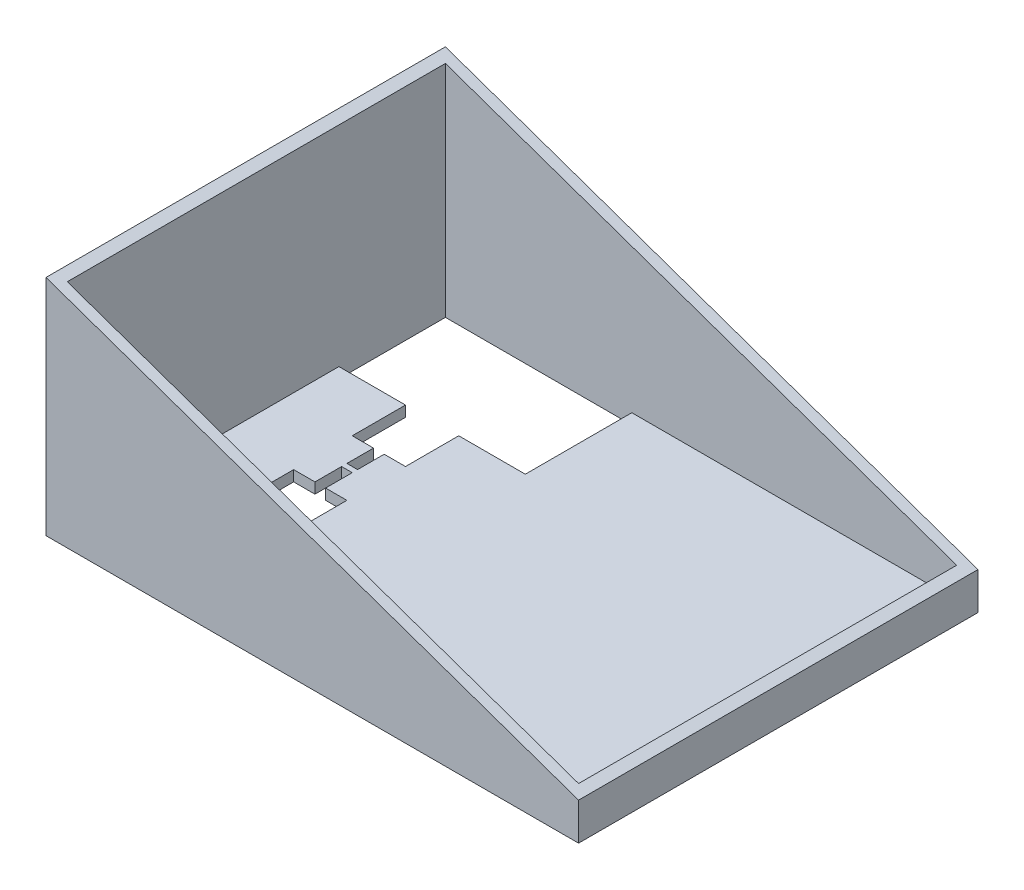
ISO-10303-21;
HEADER;
FILE_DESCRIPTION(('STEP AP214'),'2;1');
FILE_NAME('part.step','',(''),(''),'','','');
FILE_SCHEMA(('AUTOMOTIVE_DESIGN { 1 0 10303 214 1 1 1 1 }'));
ENDSEC;
DATA;
#1=APPLICATION_CONTEXT('core data for automotive mechanical design processes');
#2=APPLICATION_PROTOCOL_DEFINITION('international standard','automotive_design',2000,#1);
#3=PRODUCT_CONTEXT('',#1,'mechanical');
#4=PRODUCT('Part','Part','',(#3));
#5=PRODUCT_RELATED_PRODUCT_CATEGORY('part','',(#4));
#6=PRODUCT_DEFINITION_FORMATION('','',#4);
#7=PRODUCT_DEFINITION_CONTEXT('part definition',#1,'design');
#8=PRODUCT_DEFINITION('design','',#6,#7);
#9=PRODUCT_DEFINITION_SHAPE('','',#8);
#10=(LENGTH_UNIT() NAMED_UNIT(*) SI_UNIT(.MILLI.,.METRE.));
#11=(NAMED_UNIT(*) PLANE_ANGLE_UNIT() SI_UNIT($,.RADIAN.));
#12=(NAMED_UNIT(*) SI_UNIT($,.STERADIAN.) SOLID_ANGLE_UNIT());
#13=UNCERTAINTY_MEASURE_WITH_UNIT(LENGTH_MEASURE(1.E-05),#10,'distance_accuracy_value','');
#14=(GEOMETRIC_REPRESENTATION_CONTEXT(3) GLOBAL_UNCERTAINTY_ASSIGNED_CONTEXT((#13)) GLOBAL_UNIT_ASSIGNED_CONTEXT((#10,
#11,#12)) REPRESENTATION_CONTEXT('',''));
#15=CARTESIAN_POINT('',(0.,0.,0.));
#16=DIRECTION('',(0.,0.,1.));
#17=DIRECTION('',(1.,0.,0.));
#18=AXIS2_PLACEMENT_3D('',#15,#16,#17);
#19=CARTESIAN_POINT('',(0.,4.,0.));
#20=DIRECTION('',(0.,1.,0.));
#21=DIRECTION('',(0.,0.,1.));
#22=AXIS2_PLACEMENT_3D('',#19,#20,#21);
#23=PLANE('',#22);
#24=DIRECTION('',(1.,0.,0.));
#25=VECTOR('',#24,1.);
#26=CARTESIAN_POINT('',(0.,4.,-106.));
#27=LINE('',#26,#25);
#28=CARTESIAN_POINT('',(-196.,4.,-106.));
#29=VERTEX_POINT('',#28);
#30=CARTESIAN_POINT('',(-171.,4.,-106.));
#31=VERTEX_POINT('',#30);
#32=EDGE_CURVE('E434',#29,#31,#27,.T.);
#33=ORIENTED_EDGE('',*,*,#32,.F.);
#34=DIRECTION('',(0.,0.,1.));
#35=VECTOR('',#34,1.);
#36=CARTESIAN_POINT('',(-196.,4.,-146.));
#37=LINE('',#36,#35);
#38=CARTESIAN_POINT('',(-196.,4.,-44.));
#39=VERTEX_POINT('',#38);
#40=EDGE_CURVE('E51',#29,#39,#37,.T.);
#41=ORIENTED_EDGE('',*,*,#40,.T.);
#42=DIRECTION('',(1.,0.,0.));
#43=VECTOR('',#42,1.);
#44=CARTESIAN_POINT('',(0.,4.,-44.));
#45=LINE('',#44,#43);
#46=CARTESIAN_POINT('',(-171.,4.,-44.));
#47=VERTEX_POINT('',#46);
#48=EDGE_CURVE('E454',#39,#47,#45,.T.);
#49=ORIENTED_EDGE('',*,*,#48,.T.);
#50=DIRECTION('',(0.,0.,-1.));
#51=VECTOR('',#50,1.);
#52=CARTESIAN_POINT('',(-171.,4.,2.37310171513627E-13));
#53=LINE('',#52,#51);
#54=CARTESIAN_POINT('',(-171.,4.,-64.));
#55=VERTEX_POINT('',#54);
#56=EDGE_CURVE('E457',#47,#55,#53,.T.);
#57=ORIENTED_EDGE('',*,*,#56,.T.);
#58=DIRECTION('',(1.,0.,0.));
#59=VECTOR('',#58,1.);
#60=CARTESIAN_POINT('',(0.,4.,-64.0000000000002));
#61=LINE('',#60,#59);
#62=CARTESIAN_POINT('',(-163.,4.,-64.));
#63=VERTEX_POINT('',#62);
#64=EDGE_CURVE('E460',#55,#63,#61,.T.);
#65=ORIENTED_EDGE('',*,*,#64,.T.);
#66=DIRECTION('',(0.,0.,-1.));
#67=VECTOR('',#66,1.);
#68=CARTESIAN_POINT('',(-163.,4.,0.));
#69=LINE('',#68,#67);
#70=CARTESIAN_POINT('',(-163.,4.,-74.));
#71=VERTEX_POINT('',#70);
#72=EDGE_CURVE('E463',#63,#71,#69,.T.);
#73=ORIENTED_EDGE('',*,*,#72,.T.);
#74=DIRECTION('',(1.,0.,0.));
#75=VECTOR('',#74,1.);
#76=CARTESIAN_POINT('',(0.,4.,-74.));
#77=LINE('',#76,#75);
#78=CARTESIAN_POINT('',(-159.,4.,-74.));
#79=VERTEX_POINT('',#78);
#80=EDGE_CURVE('E467',#71,#79,#77,.T.);
#81=ORIENTED_EDGE('',*,*,#80,.T.);
#82=DIRECTION('',(0.,0.,-1.));
#83=VECTOR('',#82,1.);
#84=CARTESIAN_POINT('',(-159.,4.,0.));
#85=LINE('',#84,#83);
#86=CARTESIAN_POINT('',(-159.,4.,-64.));
#87=VERTEX_POINT('',#86);
#88=EDGE_CURVE('E468',#87,#79,#85,.T.);
#89=ORIENTED_EDGE('',*,*,#88,.F.);
#90=CARTESIAN_POINT('',(-151.,4.,-64.));
#91=VERTEX_POINT('',#90);
#92=EDGE_CURVE('E464',#87,#91,#61,.T.);
#93=ORIENTED_EDGE('',*,*,#92,.T.);
#94=DIRECTION('',(0.,0.,-1.));
#95=VECTOR('',#94,1.);
#96=CARTESIAN_POINT('',(-151.,4.,0.));
#97=LINE('',#96,#95);
#98=CARTESIAN_POINT('',(-151.,4.,-44.));
#99=VERTEX_POINT('',#98);
#100=EDGE_CURVE('E319',#99,#91,#97,.T.);
#101=ORIENTED_EDGE('',*,*,#100,.F.);
#102=CARTESIAN_POINT('',(-126.,4.,-44.));
#103=VERTEX_POINT('',#102);
#104=EDGE_CURVE('E275',#99,#103,#45,.T.);
#105=ORIENTED_EDGE('',*,*,#104,.T.);
#106=DIRECTION('',(0.,0.,-1.));
#107=VECTOR('',#106,1.);
#108=CARTESIAN_POINT('',(-126.,4.,0.));
#109=LINE('',#108,#107);
#110=CARTESIAN_POINT('',(-126.,4.,-4.));
#111=VERTEX_POINT('',#110);
#112=EDGE_CURVE('E451',#111,#103,#109,.T.);
#113=ORIENTED_EDGE('',*,*,#112,.F.);
#114=DIRECTION('',(1.,0.,0.));
#115=VECTOR('',#114,1.);
#116=CARTESIAN_POINT('',(-196.,4.,-4.));
#117=LINE('',#116,#115);
#118=CARTESIAN_POINT('',(-3.99999999999998,4.,-4.));
#119=VERTEX_POINT('',#118);
#120=EDGE_CURVE('E409',#111,#119,#117,.T.);
#121=ORIENTED_EDGE('',*,*,#120,.T.);
#122=DIRECTION('',(0.,0.,-1.));
#123=VECTOR('',#122,1.);
#124=CARTESIAN_POINT('',(-4.,4.,-146.));
#125=LINE('',#124,#123);
#126=CARTESIAN_POINT('',(-4.,4.,-146.));
#127=VERTEX_POINT('',#126);
#128=EDGE_CURVE('E422',#119,#127,#125,.T.);
#129=ORIENTED_EDGE('',*,*,#128,.T.);
#130=DIRECTION('',(-1.,0.,0.));
#131=VECTOR('',#130,1.);
#132=CARTESIAN_POINT('',(-196.,4.,-146.));
#133=LINE('',#132,#131);
#134=CARTESIAN_POINT('',(-126.,4.,-146.));
#135=VERTEX_POINT('',#134);
#136=EDGE_CURVE('E424',#127,#135,#133,.T.);
#137=ORIENTED_EDGE('',*,*,#136,.T.);
#138=DIRECTION('',(0.,0.,1.));
#139=VECTOR('',#138,1.);
#140=CARTESIAN_POINT('',(-126.,4.,0.));
#141=LINE('',#140,#139);
#142=CARTESIAN_POINT('',(-126.,4.,-106.));
#143=VERTEX_POINT('',#142);
#144=EDGE_CURVE('E304',#135,#143,#141,.T.);
#145=ORIENTED_EDGE('',*,*,#144,.T.);
#146=CARTESIAN_POINT('',(-151.,4.,-106.));
#147=VERTEX_POINT('',#146);
#148=EDGE_CURVE('E430',#147,#143,#27,.T.);
#149=ORIENTED_EDGE('',*,*,#148,.F.);
#150=DIRECTION('',(0.,0.,1.));
#151=VECTOR('',#150,1.);
#152=CARTESIAN_POINT('',(-151.,4.,0.));
#153=LINE('',#152,#151);
#154=CARTESIAN_POINT('',(-151.,4.,-86.));
#155=VERTEX_POINT('',#154);
#156=EDGE_CURVE('E433',#147,#155,#153,.T.);
#157=ORIENTED_EDGE('',*,*,#156,.T.);
#158=DIRECTION('',(1.,0.,0.));
#159=VECTOR('',#158,1.);
#160=CARTESIAN_POINT('',(1.19348975147204E-13,4.,-85.9999999999998));
#161=LINE('',#160,#159);
#162=CARTESIAN_POINT('',(-159.,4.,-86.));
#163=VERTEX_POINT('',#162);
#164=EDGE_CURVE('E436',#163,#155,#161,.T.);
#165=ORIENTED_EDGE('',*,*,#164,.F.);
#166=DIRECTION('',(0.,0.,1.));
#167=VECTOR('',#166,1.);
#168=CARTESIAN_POINT('',(-159.,4.,0.));
#169=LINE('',#168,#167);
#170=CARTESIAN_POINT('',(-159.,4.,-76.));
#171=VERTEX_POINT('',#170);
#172=EDGE_CURVE('E439',#163,#171,#169,.T.);
#173=ORIENTED_EDGE('',*,*,#172,.T.);
#174=DIRECTION('',(1.,0.,0.));
#175=VECTOR('',#174,1.);
#176=CARTESIAN_POINT('',(0.,4.,-76.));
#177=LINE('',#176,#175);
#178=CARTESIAN_POINT('',(-163.,4.,-76.));
#179=VERTEX_POINT('',#178);
#180=EDGE_CURVE('E442',#179,#171,#177,.T.);
#181=ORIENTED_EDGE('',*,*,#180,.F.);
#182=DIRECTION('',(0.,0.,1.));
#183=VECTOR('',#182,1.);
#184=CARTESIAN_POINT('',(-163.,4.,0.));
#185=LINE('',#184,#183);
#186=CARTESIAN_POINT('',(-163.,4.,-86.));
#187=VERTEX_POINT('',#186);
#188=EDGE_CURVE('E445',#187,#179,#185,.T.);
#189=ORIENTED_EDGE('',*,*,#188,.F.);
#190=CARTESIAN_POINT('',(-171.,4.,-86.));
#191=VERTEX_POINT('',#190);
#192=EDGE_CURVE('E440',#191,#187,#161,.T.);
#193=ORIENTED_EDGE('',*,*,#192,.F.);
#194=DIRECTION('',(0.,0.,1.));
#195=VECTOR('',#194,1.);
#196=CARTESIAN_POINT('',(-171.,4.,-2.37310171513628E-13));
#197=LINE('',#196,#195);
#198=EDGE_CURVE('E448',#31,#191,#197,.T.);
#199=ORIENTED_EDGE('',*,*,#198,.F.);
#200=EDGE_LOOP('',(#33,#41,#49,#57,#65,#73,#81,#89,#93,#101,#105,#113,#121,#129,#137,#145,#149,
#157,#165,#173,#181,#189,#193,#199));
#201=FACE_BOUND('',#200,.T.);
#202=ADVANCED_FACE('F43',(#201),#23,.T.);
#203=CARTESIAN_POINT('',(-126.,4.,0.));
#204=DIRECTION('',(-1.,0.,0.));
#205=DIRECTION('',(0.,0.,1.));
#206=AXIS2_PLACEMENT_3D('',#203,#204,#205);
#207=PLANE('',#206);
#208=DIRECTION('',(0.,0.,-1.));
#209=VECTOR('',#208,1.);
#210=CARTESIAN_POINT('',(-126.,0.,0.));
#211=LINE('',#210,#209);
#212=CARTESIAN_POINT('',(-126.,0.,-4.));
#213=VERTEX_POINT('',#212);
#214=CARTESIAN_POINT('',(-126.,0.,-44.));
#215=VERTEX_POINT('',#214);
#216=EDGE_CURVE('E355',#213,#215,#211,.T.);
#217=ORIENTED_EDGE('',*,*,#216,.F.);
#218=DIRECTION('',(0.,-1.,0.));
#219=VECTOR('',#218,1.);
#220=CARTESIAN_POINT('',(-126.,4.,-4.));
#221=LINE('',#220,#219);
#222=EDGE_CURVE('E408',#111,#213,#221,.T.);
#223=ORIENTED_EDGE('',*,*,#222,.F.);
#224=ORIENTED_EDGE('',*,*,#112,.T.);
#225=DIRECTION('',(0.,-1.,0.));
#226=VECTOR('',#225,1.);
#227=CARTESIAN_POINT('',(-126.,4.,-44.));
#228=LINE('',#227,#226);
#229=EDGE_CURVE('E271',#103,#215,#228,.T.);
#230=ORIENTED_EDGE('',*,*,#229,.T.);
#231=EDGE_LOOP('',(#217,#223,#224,#230));
#232=FACE_BOUND('',#231,.T.);
#233=ADVANCED_FACE('F485',(#232),#207,.T.);
#234=CARTESIAN_POINT('',(0.,4.,-4.));
#235=DIRECTION('',(0.,0.,-1.));
#236=DIRECTION('',(-1.,0.,0.));
#237=AXIS2_PLACEMENT_3D('',#234,#235,#236);
#238=PLANE('',#237);
#239=DIRECTION('',(-0.943858356366018,0.330350424728106,0.));
#240=VECTOR('',#239,1.);
#241=CARTESIAN_POINT('',(3.11804008908686,12.9086859688196,-4.));
#242=LINE('',#241,#240);
#243=CARTESIAN_POINT('',(-3.99999999999998,15.4,-4.));
#244=VERTEX_POINT('',#243);
#245=CARTESIAN_POINT('',(-196.,82.6,-4.));
#246=VERTEX_POINT('',#245);
#247=EDGE_CURVE('E425',#244,#246,#242,.T.);
#248=ORIENTED_EDGE('',*,*,#247,.F.);
#249=DIRECTION('',(0.,-1.,0.));
#250=VECTOR('',#249,1.);
#251=CARTESIAN_POINT('',(-3.99999999999998,84.,-4.));
#252=LINE('',#251,#250);
#253=EDGE_CURVE('E316',#244,#119,#252,.T.);
#254=ORIENTED_EDGE('',*,*,#253,.T.);
#255=ORIENTED_EDGE('',*,*,#120,.F.);
#256=ORIENTED_EDGE('',*,*,#222,.T.);
#257=DIRECTION('',(1.,0.,0.));
#258=VECTOR('',#257,1.);
#259=CARTESIAN_POINT('',(0.,0.,-4.));
#260=LINE('',#259,#258);
#261=CARTESIAN_POINT('',(-196.,0.,-4.));
#262=VERTEX_POINT('',#261);
#263=EDGE_CURVE('E358',#262,#213,#260,.T.);
#264=ORIENTED_EDGE('',*,*,#263,.F.);
#265=DIRECTION('',(0.,-1.,0.));
#266=VECTOR('',#265,1.);
#267=CARTESIAN_POINT('',(-196.,4.,-4.));
#268=LINE('',#267,#266);
#269=EDGE_CURVE('E407',#246,#262,#268,.T.);
#270=ORIENTED_EDGE('',*,*,#269,.F.);
#271=EDGE_LOOP('',(#248,#254,#255,#256,#264,#270));
#272=FACE_BOUND('',#271,.T.);
#273=ADVANCED_FACE('F493',(#272),#238,.T.);
#274=CARTESIAN_POINT('',(-196.,4.,0.));
#275=DIRECTION('',(1.,0.,0.));
#276=DIRECTION('',(0.,0.,-1.));
#277=AXIS2_PLACEMENT_3D('',#274,#275,#276);
#278=PLANE('',#277);
#279=DIRECTION('',(0.,0.,-1.));
#280=VECTOR('',#279,1.);
#281=CARTESIAN_POINT('',(-196.,82.6,0.));
#282=LINE('',#281,#280);
#283=CARTESIAN_POINT('',(-196.,82.6,-146.));
#284=VERTEX_POINT('',#283);
#285=EDGE_CURVE('E499',#246,#284,#282,.T.);
#286=ORIENTED_EDGE('',*,*,#285,.F.);
#287=ORIENTED_EDGE('',*,*,#269,.T.);
#288=DIRECTION('',(0.,0.,1.));
#289=VECTOR('',#288,1.);
#290=CARTESIAN_POINT('',(-196.,0.,0.));
#291=LINE('',#290,#289);
#292=CARTESIAN_POINT('',(-196.,0.,-44.));
#293=VERTEX_POINT('',#292);
#294=EDGE_CURVE('E346',#293,#262,#291,.T.);
#295=ORIENTED_EDGE('',*,*,#294,.F.);
#296=DIRECTION('',(0.,-1.,0.));
#297=VECTOR('',#296,1.);
#298=CARTESIAN_POINT('',(-196.,4.,-44.));
#299=LINE('',#298,#297);
#300=EDGE_CURVE('E405',#39,#293,#299,.T.);
#301=ORIENTED_EDGE('',*,*,#300,.F.);
#302=ORIENTED_EDGE('',*,*,#40,.F.);
#303=DIRECTION('',(0.,-1.,0.));
#304=VECTOR('',#303,1.);
#305=CARTESIAN_POINT('',(-196.,4.,-106.));
#306=LINE('',#305,#304);
#307=CARTESIAN_POINT('',(-196.,0.,-106.));
#308=VERTEX_POINT('',#307);
#309=EDGE_CURVE('E274',#29,#308,#306,.T.);
#310=ORIENTED_EDGE('',*,*,#309,.T.);
#311=CARTESIAN_POINT('',(-196.,0.,-146.));
#312=VERTEX_POINT('',#311);
#313=EDGE_CURVE('E343',#312,#308,#291,.T.);
#314=ORIENTED_EDGE('',*,*,#313,.F.);
#315=DIRECTION('',(0.,-1.,0.));
#316=VECTOR('',#315,1.);
#317=CARTESIAN_POINT('',(-196.,4.,-146.));
#318=LINE('',#317,#316);
#319=EDGE_CURVE('E272',#284,#312,#318,.T.);
#320=ORIENTED_EDGE('',*,*,#319,.F.);
#321=EDGE_LOOP('',(#286,#287,#295,#301,#302,#310,#314,#320));
#322=FACE_BOUND('',#321,.T.);
#323=ADVANCED_FACE('F497',(#322),#278,.T.);
#324=CARTESIAN_POINT('',(0.,4.,-44.));
#325=DIRECTION('',(0.,0.,-1.));
#326=DIRECTION('',(-1.,0.,0.));
#327=AXIS2_PLACEMENT_3D('',#324,#325,#326);
#328=PLANE('',#327);
#329=DIRECTION('',(1.,0.,0.));
#330=VECTOR('',#329,1.);
#331=CARTESIAN_POINT('',(0.,0.,-44.));
#332=LINE('',#331,#330);
#333=CARTESIAN_POINT('',(-171.,0.,-44.));
#334=VERTEX_POINT('',#333);
#335=EDGE_CURVE('E361',#293,#334,#332,.T.);
#336=ORIENTED_EDGE('',*,*,#335,.T.);
#337=DIRECTION('',(0.,-1.,0.));
#338=VECTOR('',#337,1.);
#339=CARTESIAN_POINT('',(-171.,4.,-44.));
#340=LINE('',#339,#338);
#341=EDGE_CURVE('E402',#47,#334,#340,.T.);
#342=ORIENTED_EDGE('',*,*,#341,.F.);
#343=ORIENTED_EDGE('',*,*,#48,.F.);
#344=ORIENTED_EDGE('',*,*,#300,.T.);
#345=EDGE_LOOP('',(#336,#342,#343,#344));
#346=FACE_BOUND('',#345,.T.);
#347=ADVANCED_FACE('F521',(#346),#328,.F.);
#348=CARTESIAN_POINT('',(-171.,4.,2.37310171513627E-13));
#349=DIRECTION('',(-1.,0.,0.));
#350=DIRECTION('',(0.,0.,1.));
#351=AXIS2_PLACEMENT_3D('',#348,#349,#350);
#352=PLANE('',#351);
#353=DIRECTION('',(0.,0.,-1.));
#354=VECTOR('',#353,1.);
#355=CARTESIAN_POINT('',(-171.,0.,2.37310171513627E-13));
#356=LINE('',#355,#354);
#357=CARTESIAN_POINT('',(-171.,0.,-64.));
#358=VERTEX_POINT('',#357);
#359=EDGE_CURVE('E364',#334,#358,#356,.T.);
#360=ORIENTED_EDGE('',*,*,#359,.T.);
#361=DIRECTION('',(0.,-1.,0.));
#362=VECTOR('',#361,1.);
#363=CARTESIAN_POINT('',(-171.,4.,-64.));
#364=LINE('',#363,#362);
#365=EDGE_CURVE('E399',#55,#358,#364,.T.);
#366=ORIENTED_EDGE('',*,*,#365,.F.);
#367=ORIENTED_EDGE('',*,*,#56,.F.);
#368=ORIENTED_EDGE('',*,*,#341,.T.);
#369=EDGE_LOOP('',(#360,#366,#367,#368));
#370=FACE_BOUND('',#369,.T.);
#371=ADVANCED_FACE('F542',(#370),#352,.F.);
#372=CARTESIAN_POINT('',(0.,4.,-64.0000000000002));
#373=DIRECTION('',(0.,0.,-1.));
#374=DIRECTION('',(-1.,0.,0.));
#375=AXIS2_PLACEMENT_3D('',#372,#373,#374);
#376=PLANE('',#375);
#377=DIRECTION('',(1.,0.,0.));
#378=VECTOR('',#377,1.);
#379=CARTESIAN_POINT('',(0.,0.,-64.0000000000002));
#380=LINE('',#379,#378);
#381=CARTESIAN_POINT('',(-163.,0.,-64.));
#382=VERTEX_POINT('',#381);
#383=EDGE_CURVE('E368',#358,#382,#380,.T.);
#384=ORIENTED_EDGE('',*,*,#383,.T.);
#385=DIRECTION('',(0.,-1.,0.));
#386=VECTOR('',#385,1.);
#387=CARTESIAN_POINT('',(-163.,4.,-64.));
#388=LINE('',#387,#386);
#389=EDGE_CURVE('E396',#63,#382,#388,.T.);
#390=ORIENTED_EDGE('',*,*,#389,.F.);
#391=ORIENTED_EDGE('',*,*,#64,.F.);
#392=ORIENTED_EDGE('',*,*,#365,.T.);
#393=EDGE_LOOP('',(#384,#390,#391,#392));
#394=FACE_BOUND('',#393,.T.);
#395=ADVANCED_FACE('F531',(#394),#376,.F.);
#396=CARTESIAN_POINT('',(-163.,4.,0.));
#397=DIRECTION('',(-1.,0.,0.));
#398=DIRECTION('',(0.,0.,1.));
#399=AXIS2_PLACEMENT_3D('',#396,#397,#398);
#400=PLANE('',#399);
#401=DIRECTION('',(0.,0.,-1.));
#402=VECTOR('',#401,1.);
#403=CARTESIAN_POINT('',(-163.,0.,0.));
#404=LINE('',#403,#402);
#405=CARTESIAN_POINT('',(-163.,0.,-74.));
#406=VERTEX_POINT('',#405);
#407=EDGE_CURVE('E371',#382,#406,#404,.T.);
#408=ORIENTED_EDGE('',*,*,#407,.T.);
#409=DIRECTION('',(0.,-1.,0.));
#410=VECTOR('',#409,1.);
#411=CARTESIAN_POINT('',(-163.,4.,-74.));
#412=LINE('',#411,#410);
#413=EDGE_CURVE('E393',#71,#406,#412,.T.);
#414=ORIENTED_EDGE('',*,*,#413,.F.);
#415=ORIENTED_EDGE('',*,*,#72,.F.);
#416=ORIENTED_EDGE('',*,*,#389,.T.);
#417=EDGE_LOOP('',(#408,#414,#415,#416));
#418=FACE_BOUND('',#417,.T.);
#419=ADVANCED_FACE('F537',(#418),#400,.F.);
#420=CARTESIAN_POINT('',(0.,4.,-74.));
#421=DIRECTION('',(0.,0.,-1.));
#422=DIRECTION('',(-1.,0.,0.));
#423=AXIS2_PLACEMENT_3D('',#420,#421,#422);
#424=PLANE('',#423);
#425=DIRECTION('',(1.,0.,0.));
#426=VECTOR('',#425,1.);
#427=CARTESIAN_POINT('',(0.,0.,-74.));
#428=LINE('',#427,#426);
#429=CARTESIAN_POINT('',(-159.,0.,-74.));
#430=VERTEX_POINT('',#429);
#431=EDGE_CURVE('E375',#406,#430,#428,.T.);
#432=ORIENTED_EDGE('',*,*,#431,.T.);
#433=DIRECTION('',(0.,-1.,0.));
#434=VECTOR('',#433,1.);
#435=CARTESIAN_POINT('',(-159.,4.,-74.));
#436=LINE('',#435,#434);
#437=EDGE_CURVE('E391',#79,#430,#436,.T.);
#438=ORIENTED_EDGE('',*,*,#437,.F.);
#439=ORIENTED_EDGE('',*,*,#80,.F.);
#440=ORIENTED_EDGE('',*,*,#413,.T.);
#441=EDGE_LOOP('',(#432,#438,#439,#440));
#442=FACE_BOUND('',#441,.T.);
#443=ADVANCED_FACE('F534',(#442),#424,.F.);
#444=CARTESIAN_POINT('',(-159.,4.,0.));
#445=DIRECTION('',(-1.,0.,0.));
#446=DIRECTION('',(0.,0.,1.));
#447=AXIS2_PLACEMENT_3D('',#444,#445,#446);
#448=PLANE('',#447);
#449=DIRECTION('',(0.,0.,-1.));
#450=VECTOR('',#449,1.);
#451=CARTESIAN_POINT('',(-159.,0.,0.));
#452=LINE('',#451,#450);
#453=CARTESIAN_POINT('',(-159.,0.,-64.));
#454=VERTEX_POINT('',#453);
#455=EDGE_CURVE('E378',#454,#430,#452,.T.);
#456=ORIENTED_EDGE('',*,*,#455,.F.);
#457=DIRECTION('',(0.,-1.,0.));
#458=VECTOR('',#457,1.);
#459=CARTESIAN_POINT('',(-159.,4.,-64.));
#460=LINE('',#459,#458);
#461=EDGE_CURVE('E389',#87,#454,#460,.T.);
#462=ORIENTED_EDGE('',*,*,#461,.F.);
#463=ORIENTED_EDGE('',*,*,#88,.T.);
#464=ORIENTED_EDGE('',*,*,#437,.T.);
#465=EDGE_LOOP('',(#456,#462,#463,#464));
#466=FACE_BOUND('',#465,.T.);
#467=ADVANCED_FACE('F529',(#466),#448,.T.);
#468=CARTESIAN_POINT('',(-151.,0.,-64.));
#469=VERTEX_POINT('',#468);
#470=EDGE_CURVE('E372',#454,#469,#380,.T.);
#471=ORIENTED_EDGE('',*,*,#470,.T.);
#472=DIRECTION('',(0.,-1.,0.));
#473=VECTOR('',#472,1.);
#474=CARTESIAN_POINT('',(-151.,4.,-64.));
#475=LINE('',#474,#473);
#476=EDGE_CURVE('E387',#91,#469,#475,.T.);
#477=ORIENTED_EDGE('',*,*,#476,.F.);
#478=ORIENTED_EDGE('',*,*,#92,.F.);
#479=ORIENTED_EDGE('',*,*,#461,.T.);
#480=EDGE_LOOP('',(#471,#477,#478,#479));
#481=FACE_BOUND('',#480,.T.);
#482=ADVANCED_FACE('F526',(#481),#376,.F.);
#483=CARTESIAN_POINT('',(-151.,4.,0.));
#484=DIRECTION('',(-1.,0.,0.));
#485=DIRECTION('',(0.,0.,1.));
#486=AXIS2_PLACEMENT_3D('',#483,#484,#485);
#487=PLANE('',#486);
#488=DIRECTION('',(0.,0.,-1.));
#489=VECTOR('',#488,1.);
#490=CARTESIAN_POINT('',(-151.,0.,0.));
#491=LINE('',#490,#489);
#492=CARTESIAN_POINT('',(-151.,0.,-44.));
#493=VERTEX_POINT('',#492);
#494=EDGE_CURVE('E381',#493,#469,#491,.T.);
#495=ORIENTED_EDGE('',*,*,#494,.F.);
#496=DIRECTION('',(0.,-1.,0.));
#497=VECTOR('',#496,1.);
#498=CARTESIAN_POINT('',(-151.,4.,-44.));
#499=LINE('',#498,#497);
#500=EDGE_CURVE('E385',#99,#493,#499,.T.);
#501=ORIENTED_EDGE('',*,*,#500,.F.);
#502=ORIENTED_EDGE('',*,*,#100,.T.);
#503=ORIENTED_EDGE('',*,*,#476,.T.);
#504=EDGE_LOOP('',(#495,#501,#502,#503));
#505=FACE_BOUND('',#504,.T.);
#506=ADVANCED_FACE('F522',(#505),#487,.T.);
#507=CARTESIAN_POINT('',(-200.,4.,0.));
#508=DIRECTION('',(-1.,0.,0.));
#509=DIRECTION('',(0.,0.,1.));
#510=AXIS2_PLACEMENT_3D('',#507,#508,#509);
#511=PLANE('',#510);
#512=DIRECTION('',(0.,0.,-1.));
#513=VECTOR('',#512,1.);
#514=CARTESIAN_POINT('',(-200.,0.,0.));
#515=LINE('',#514,#513);
#516=CARTESIAN_POINT('',(-200.,0.,0.));
#517=VERTEX_POINT('',#516);
#518=CARTESIAN_POINT('',(-200.,0.,-150.));
#519=VERTEX_POINT('',#518);
#520=EDGE_CURVE('E345',#517,#519,#515,.T.);
#521=ORIENTED_EDGE('',*,*,#520,.F.);
#522=DIRECTION('',(0.,-1.,0.));
#523=VECTOR('',#522,1.);
#524=CARTESIAN_POINT('',(-200.,4.,0.));
#525=LINE('',#524,#523);
#526=CARTESIAN_POINT('',(-200.,84.,0.));
#527=VERTEX_POINT('',#526);
#528=EDGE_CURVE('E264',#527,#517,#525,.T.);
#529=ORIENTED_EDGE('',*,*,#528,.F.);
#530=DIRECTION('',(0.,0.,1.));
#531=VECTOR('',#530,1.);
#532=CARTESIAN_POINT('',(-200.,84.,0.));
#533=LINE('',#532,#531);
#534=CARTESIAN_POINT('',(-200.,84.,-150.));
#535=VERTEX_POINT('',#534);
#536=EDGE_CURVE('E312',#535,#527,#533,.T.);
#537=ORIENTED_EDGE('',*,*,#536,.F.);
#538=DIRECTION('',(0.,-1.,0.));
#539=VECTOR('',#538,1.);
#540=CARTESIAN_POINT('',(-200.,4.,-150.));
#541=LINE('',#540,#539);
#542=EDGE_CURVE('E255',#535,#519,#541,.T.);
#543=ORIENTED_EDGE('',*,*,#542,.T.);
#544=EDGE_LOOP('',(#521,#529,#537,#543));
#545=FACE_BOUND('',#544,.T.);
#546=ADVANCED_FACE('F525',(#545),#511,.T.);
#547=CARTESIAN_POINT('',(0.,4.,0.));
#548=DIRECTION('',(0.,0.,1.));
#549=DIRECTION('',(1.,0.,0.));
#550=AXIS2_PLACEMENT_3D('',#547,#548,#549);
#551=PLANE('',#550);
#552=DIRECTION('',(0.943858356366017,-0.330350424728106,0.));
#553=VECTOR('',#552,1.);
#554=CARTESIAN_POINT('',(-200.,84.,0.));
#555=LINE('',#554,#553);
#556=CARTESIAN_POINT('',(0.,14.,0.));
#557=VERTEX_POINT('',#556);
#558=EDGE_CURVE('E245',#527,#557,#555,.T.);
#559=ORIENTED_EDGE('',*,*,#558,.F.);
#560=ORIENTED_EDGE('',*,*,#528,.T.);
#561=DIRECTION('',(-1.,0.,0.));
#562=VECTOR('',#561,1.);
#563=CARTESIAN_POINT('',(0.,0.,0.));
#564=LINE('',#563,#562);
#565=CARTESIAN_POINT('',(0.,0.,0.));
#566=VERTEX_POINT('',#565);
#567=EDGE_CURVE('E349',#566,#517,#564,.T.);
#568=ORIENTED_EDGE('',*,*,#567,.F.);
#569=DIRECTION('',(0.,-1.,0.));
#570=VECTOR('',#569,1.);
#571=CARTESIAN_POINT('',(0.,4.,0.));
#572=LINE('',#571,#570);
#573=EDGE_CURVE('E262',#557,#566,#572,.T.);
#574=ORIENTED_EDGE('',*,*,#573,.F.);
#575=EDGE_LOOP('',(#559,#560,#568,#574));
#576=FACE_BOUND('',#575,.T.);
#577=ADVANCED_FACE('F555',(#576),#551,.T.);
#578=CARTESIAN_POINT('',(0.,4.,0.));
#579=DIRECTION('',(-1.,0.,0.));
#580=DIRECTION('',(0.,0.,1.));
#581=AXIS2_PLACEMENT_3D('',#578,#579,#580);
#582=PLANE('',#581);
#583=DIRECTION('',(0.,-1.,0.));
#584=VECTOR('',#583,1.);
#585=CARTESIAN_POINT('',(0.,4.,-150.));
#586=LINE('',#585,#584);
#587=CARTESIAN_POINT('',(0.,14.,-150.));
#588=VERTEX_POINT('',#587);
#589=CARTESIAN_POINT('',(0.,0.,-150.));
#590=VERTEX_POINT('',#589);
#591=EDGE_CURVE('E253',#588,#590,#586,.T.);
#592=ORIENTED_EDGE('',*,*,#591,.F.);
#593=DIRECTION('',(0.,0.,1.));
#594=VECTOR('',#593,1.);
#595=CARTESIAN_POINT('',(0.,14.,-150.));
#596=LINE('',#595,#594);
#597=EDGE_CURVE('E239',#588,#557,#596,.T.);
#598=ORIENTED_EDGE('',*,*,#597,.T.);
#599=ORIENTED_EDGE('',*,*,#573,.T.);
#600=DIRECTION('',(0.,0.,-1.));
#601=VECTOR('',#600,1.);
#602=CARTESIAN_POINT('',(0.,0.,0.));
#603=LINE('',#602,#601);
#604=EDGE_CURVE('E261',#566,#590,#603,.T.);
#605=ORIENTED_EDGE('',*,*,#604,.T.);
#606=EDGE_LOOP('',(#592,#598,#599,#605));
#607=FACE_BOUND('',#606,.T.);
#608=ADVANCED_FACE('F259',(#607),#582,.F.);
#609=CARTESIAN_POINT('',(0.,4.,-146.));
#610=DIRECTION('',(0.,0.,-1.));
#611=DIRECTION('',(-1.,0.,0.));
#612=AXIS2_PLACEMENT_3D('',#609,#610,#611);
#613=PLANE('',#612);
#614=DIRECTION('',(0.,-1.,0.));
#615=VECTOR('',#614,1.);
#616=CARTESIAN_POINT('',(-4.,84.,-146.));
#617=LINE('',#616,#615);
#618=CARTESIAN_POINT('',(-4.,15.4,-146.));
#619=VERTEX_POINT('',#618);
#620=EDGE_CURVE('E64',#619,#127,#617,.T.);
#621=ORIENTED_EDGE('',*,*,#620,.F.);
#622=DIRECTION('',(-0.943858356366018,0.330350424728106,0.));
#623=VECTOR('',#622,1.);
#624=CARTESIAN_POINT('',(3.11804008908686,12.9086859688196,-146.));
#625=LINE('',#624,#623);
#626=EDGE_CURVE('E57',#619,#284,#625,.T.);
#627=ORIENTED_EDGE('',*,*,#626,.T.);
#628=ORIENTED_EDGE('',*,*,#319,.T.);
#629=DIRECTION('',(1.,0.,0.));
#630=VECTOR('',#629,1.);
#631=CARTESIAN_POINT('',(0.,0.,-146.));
#632=LINE('',#631,#630);
#633=CARTESIAN_POINT('',(-126.,0.,-146.));
#634=VERTEX_POINT('',#633);
#635=EDGE_CURVE('E307',#312,#634,#632,.T.);
#636=ORIENTED_EDGE('',*,*,#635,.T.);
#637=DIRECTION('',(0.,-1.,0.));
#638=VECTOR('',#637,1.);
#639=CARTESIAN_POINT('',(-126.,4.,-146.));
#640=LINE('',#639,#638);
#641=EDGE_CURVE('E266',#135,#634,#640,.T.);
#642=ORIENTED_EDGE('',*,*,#641,.F.);
#643=ORIENTED_EDGE('',*,*,#136,.F.);
#644=EDGE_LOOP('',(#621,#627,#628,#636,#642,#643));
#645=FACE_BOUND('',#644,.T.);
#646=ADVANCED_FACE('F45',(#645),#613,.F.);
#647=CARTESIAN_POINT('',(-126.,4.,0.));
#648=DIRECTION('',(1.,0.,0.));
#649=DIRECTION('',(0.,0.,-1.));
#650=AXIS2_PLACEMENT_3D('',#647,#648,#649);
#651=PLANE('',#650);
#652=DIRECTION('',(0.,0.,1.));
#653=VECTOR('',#652,1.);
#654=CARTESIAN_POINT('',(-126.,0.,0.));
#655=LINE('',#654,#653);
#656=CARTESIAN_POINT('',(-126.,0.,-106.));
#657=VERTEX_POINT('',#656);
#658=EDGE_CURVE('E302',#634,#657,#655,.T.);
#659=ORIENTED_EDGE('',*,*,#658,.T.);
#660=DIRECTION('',(0.,-1.,0.));
#661=VECTOR('',#660,1.);
#662=CARTESIAN_POINT('',(-126.,4.,-106.));
#663=LINE('',#662,#661);
#664=EDGE_CURVE('E293',#143,#657,#663,.T.);
#665=ORIENTED_EDGE('',*,*,#664,.F.);
#666=ORIENTED_EDGE('',*,*,#144,.F.);
#667=ORIENTED_EDGE('',*,*,#641,.T.);
#668=EDGE_LOOP('',(#659,#665,#666,#667));
#669=FACE_BOUND('',#668,.T.);
#670=ADVANCED_FACE('F300',(#669),#651,.F.);
#671=CARTESIAN_POINT('',(0.,4.,-106.));
#672=DIRECTION('',(0.,0.,-1.));
#673=DIRECTION('',(-1.,0.,0.));
#674=AXIS2_PLACEMENT_3D('',#671,#672,#673);
#675=PLANE('',#674);
#676=DIRECTION('',(1.,0.,0.));
#677=VECTOR('',#676,1.);
#678=CARTESIAN_POINT('',(0.,0.,-106.));
#679=LINE('',#678,#677);
#680=CARTESIAN_POINT('',(-151.,0.,-106.));
#681=VERTEX_POINT('',#680);
#682=EDGE_CURVE('E314',#681,#657,#679,.T.);
#683=ORIENTED_EDGE('',*,*,#682,.F.);
#684=DIRECTION('',(0.,-1.,0.));
#685=VECTOR('',#684,1.);
#686=CARTESIAN_POINT('',(-151.,4.,-106.));
#687=LINE('',#686,#685);
#688=EDGE_CURVE('E291',#147,#681,#687,.T.);
#689=ORIENTED_EDGE('',*,*,#688,.F.);
#690=ORIENTED_EDGE('',*,*,#148,.T.);
#691=ORIENTED_EDGE('',*,*,#664,.T.);
#692=EDGE_LOOP('',(#683,#689,#690,#691));
#693=FACE_BOUND('',#692,.T.);
#694=ADVANCED_FACE('F566',(#693),#675,.T.);
#695=CARTESIAN_POINT('',(-151.,4.,0.));
#696=DIRECTION('',(1.,0.,0.));
#697=DIRECTION('',(0.,0.,-1.));
#698=AXIS2_PLACEMENT_3D('',#695,#696,#697);
#699=PLANE('',#698);
#700=DIRECTION('',(0.,0.,1.));
#701=VECTOR('',#700,1.);
#702=CARTESIAN_POINT('',(-151.,0.,0.));
#703=LINE('',#702,#701);
#704=CARTESIAN_POINT('',(-151.,0.,-86.));
#705=VERTEX_POINT('',#704);
#706=EDGE_CURVE('E323',#681,#705,#703,.T.);
#707=ORIENTED_EDGE('',*,*,#706,.T.);
#708=DIRECTION('',(0.,-1.,0.));
#709=VECTOR('',#708,1.);
#710=CARTESIAN_POINT('',(-151.,4.,-86.));
#711=LINE('',#710,#709);
#712=EDGE_CURVE('E289',#155,#705,#711,.T.);
#713=ORIENTED_EDGE('',*,*,#712,.F.);
#714=ORIENTED_EDGE('',*,*,#156,.F.);
#715=ORIENTED_EDGE('',*,*,#688,.T.);
#716=EDGE_LOOP('',(#707,#713,#714,#715));
#717=FACE_BOUND('',#716,.T.);
#718=ADVANCED_FACE('F587',(#717),#699,.F.);
#719=CARTESIAN_POINT('',(1.19348975147204E-13,4.,-85.9999999999998));
#720=DIRECTION('',(0.,0.,-1.));
#721=DIRECTION('',(-1.,0.,0.));
#722=AXIS2_PLACEMENT_3D('',#719,#720,#721);
#723=PLANE('',#722);
#724=DIRECTION('',(1.,0.,0.));
#725=VECTOR('',#724,1.);
#726=CARTESIAN_POINT('',(1.19348975147204E-13,0.,-85.9999999999998));
#727=LINE('',#726,#725);
#728=CARTESIAN_POINT('',(-159.,0.,-86.));
#729=VERTEX_POINT('',#728);
#730=EDGE_CURVE('E327',#729,#705,#727,.T.);
#731=ORIENTED_EDGE('',*,*,#730,.F.);
#732=DIRECTION('',(0.,-1.,0.));
#733=VECTOR('',#732,1.);
#734=CARTESIAN_POINT('',(-159.,4.,-86.));
#735=LINE('',#734,#733);
#736=EDGE_CURVE('E287',#163,#729,#735,.T.);
#737=ORIENTED_EDGE('',*,*,#736,.F.);
#738=ORIENTED_EDGE('',*,*,#164,.T.);
#739=ORIENTED_EDGE('',*,*,#712,.T.);
#740=EDGE_LOOP('',(#731,#737,#738,#739));
#741=FACE_BOUND('',#740,.T.);
#742=ADVANCED_FACE('F575',(#741),#723,.T.);
#743=CARTESIAN_POINT('',(-159.,4.,0.));
#744=DIRECTION('',(1.,0.,0.));
#745=DIRECTION('',(0.,0.,-1.));
#746=AXIS2_PLACEMENT_3D('',#743,#744,#745);
#747=PLANE('',#746);
#748=DIRECTION('',(0.,0.,1.));
#749=VECTOR('',#748,1.);
#750=CARTESIAN_POINT('',(-159.,0.,0.));
#751=LINE('',#750,#749);
#752=CARTESIAN_POINT('',(-159.,0.,-76.));
#753=VERTEX_POINT('',#752);
#754=EDGE_CURVE('E330',#729,#753,#751,.T.);
#755=ORIENTED_EDGE('',*,*,#754,.T.);
#756=DIRECTION('',(0.,-1.,0.));
#757=VECTOR('',#756,1.);
#758=CARTESIAN_POINT('',(-159.,4.,-76.));
#759=LINE('',#758,#757);
#760=EDGE_CURVE('E285',#171,#753,#759,.T.);
#761=ORIENTED_EDGE('',*,*,#760,.F.);
#762=ORIENTED_EDGE('',*,*,#172,.F.);
#763=ORIENTED_EDGE('',*,*,#736,.T.);
#764=EDGE_LOOP('',(#755,#761,#762,#763));
#765=FACE_BOUND('',#764,.T.);
#766=ADVANCED_FACE('F582',(#765),#747,.F.);
#767=CARTESIAN_POINT('',(0.,4.,-76.));
#768=DIRECTION('',(0.,0.,-1.));
#769=DIRECTION('',(-1.,0.,0.));
#770=AXIS2_PLACEMENT_3D('',#767,#768,#769);
#771=PLANE('',#770);
#772=DIRECTION('',(1.,0.,0.));
#773=VECTOR('',#772,1.);
#774=CARTESIAN_POINT('',(0.,0.,-76.));
#775=LINE('',#774,#773);
#776=CARTESIAN_POINT('',(-163.,0.,-76.));
#777=VERTEX_POINT('',#776);
#778=EDGE_CURVE('E334',#777,#753,#775,.T.);
#779=ORIENTED_EDGE('',*,*,#778,.F.);
#780=DIRECTION('',(0.,-1.,0.));
#781=VECTOR('',#780,1.);
#782=CARTESIAN_POINT('',(-163.,4.,-76.));
#783=LINE('',#782,#781);
#784=EDGE_CURVE('E283',#179,#777,#783,.T.);
#785=ORIENTED_EDGE('',*,*,#784,.F.);
#786=ORIENTED_EDGE('',*,*,#180,.T.);
#787=ORIENTED_EDGE('',*,*,#760,.T.);
#788=EDGE_LOOP('',(#779,#785,#786,#787));
#789=FACE_BOUND('',#788,.T.);
#790=ADVANCED_FACE('F578',(#789),#771,.T.);
#791=CARTESIAN_POINT('',(-163.,4.,0.));
#792=DIRECTION('',(1.,0.,0.));
#793=DIRECTION('',(0.,0.,-1.));
#794=AXIS2_PLACEMENT_3D('',#791,#792,#793);
#795=PLANE('',#794);
#796=DIRECTION('',(0.,0.,1.));
#797=VECTOR('',#796,1.);
#798=CARTESIAN_POINT('',(-163.,0.,0.));
#799=LINE('',#798,#797);
#800=CARTESIAN_POINT('',(-163.,0.,-86.));
#801=VERTEX_POINT('',#800);
#802=EDGE_CURVE('E337',#801,#777,#799,.T.);
#803=ORIENTED_EDGE('',*,*,#802,.F.);
#804=DIRECTION('',(0.,-1.,0.));
#805=VECTOR('',#804,1.);
#806=CARTESIAN_POINT('',(-163.,4.,-86.));
#807=LINE('',#806,#805);
#808=EDGE_CURVE('E281',#187,#801,#807,.T.);
#809=ORIENTED_EDGE('',*,*,#808,.F.);
#810=ORIENTED_EDGE('',*,*,#188,.T.);
#811=ORIENTED_EDGE('',*,*,#784,.T.);
#812=EDGE_LOOP('',(#803,#809,#810,#811));
#813=FACE_BOUND('',#812,.T.);
#814=ADVANCED_FACE('F573',(#813),#795,.T.);
#815=CARTESIAN_POINT('',(-171.,0.,-86.));
#816=VERTEX_POINT('',#815);
#817=EDGE_CURVE('E331',#816,#801,#727,.T.);
#818=ORIENTED_EDGE('',*,*,#817,.F.);
#819=DIRECTION('',(0.,-1.,0.));
#820=VECTOR('',#819,1.);
#821=CARTESIAN_POINT('',(-171.,4.,-86.));
#822=LINE('',#821,#820);
#823=EDGE_CURVE('E279',#191,#816,#822,.T.);
#824=ORIENTED_EDGE('',*,*,#823,.F.);
#825=ORIENTED_EDGE('',*,*,#192,.T.);
#826=ORIENTED_EDGE('',*,*,#808,.T.);
#827=EDGE_LOOP('',(#818,#824,#825,#826));
#828=FACE_BOUND('',#827,.T.);
#829=ADVANCED_FACE('F569',(#828),#723,.T.);
#830=CARTESIAN_POINT('',(-171.,4.,-2.37310171513628E-13));
#831=DIRECTION('',(1.,0.,0.));
#832=DIRECTION('',(0.,0.,-1.));
#833=AXIS2_PLACEMENT_3D('',#830,#831,#832);
#834=PLANE('',#833);
#835=DIRECTION('',(0.,0.,1.));
#836=VECTOR('',#835,1.);
#837=CARTESIAN_POINT('',(-171.,0.,-2.37310171513628E-13));
#838=LINE('',#837,#836);
#839=CARTESIAN_POINT('',(-171.,0.,-106.));
#840=VERTEX_POINT('',#839);
#841=EDGE_CURVE('E340',#840,#816,#838,.T.);
#842=ORIENTED_EDGE('',*,*,#841,.F.);
#843=DIRECTION('',(0.,-1.,0.));
#844=VECTOR('',#843,1.);
#845=CARTESIAN_POINT('',(-171.,4.,-106.));
#846=LINE('',#845,#844);
#847=EDGE_CURVE('E277',#31,#840,#846,.T.);
#848=ORIENTED_EDGE('',*,*,#847,.F.);
#849=ORIENTED_EDGE('',*,*,#198,.T.);
#850=ORIENTED_EDGE('',*,*,#823,.T.);
#851=EDGE_LOOP('',(#842,#848,#849,#850));
#852=FACE_BOUND('',#851,.T.);
#853=ADVANCED_FACE('F564',(#852),#834,.T.);
#854=EDGE_CURVE('E324',#308,#840,#679,.T.);
#855=ORIENTED_EDGE('',*,*,#854,.F.);
#856=ORIENTED_EDGE('',*,*,#309,.F.);
#857=ORIENTED_EDGE('',*,*,#32,.T.);
#858=ORIENTED_EDGE('',*,*,#847,.T.);
#859=EDGE_LOOP('',(#855,#856,#857,#858));
#860=FACE_BOUND('',#859,.T.);
#861=ADVANCED_FACE('F552',(#860),#675,.T.);
#862=CARTESIAN_POINT('',(0.,4.,-150.));
#863=DIRECTION('',(0.,0.,1.));
#864=DIRECTION('',(1.,0.,0.));
#865=AXIS2_PLACEMENT_3D('',#862,#863,#864);
#866=PLANE('',#865);
#867=ORIENTED_EDGE('',*,*,#542,.F.);
#868=DIRECTION('',(0.943858356366017,-0.330350424728106,0.));
#869=VECTOR('',#868,1.);
#870=CARTESIAN_POINT('',(-200.,84.,-150.));
#871=LINE('',#870,#869);
#872=EDGE_CURVE('E242',#535,#588,#871,.T.);
#873=ORIENTED_EDGE('',*,*,#872,.T.);
#874=ORIENTED_EDGE('',*,*,#591,.T.);
#875=DIRECTION('',(-1.,0.,0.));
#876=VECTOR('',#875,1.);
#877=CARTESIAN_POINT('',(0.,0.,-150.));
#878=LINE('',#877,#876);
#879=EDGE_CURVE('E353',#590,#519,#878,.T.);
#880=ORIENTED_EDGE('',*,*,#879,.T.);
#881=EDGE_LOOP('',(#867,#873,#874,#880));
#882=FACE_BOUND('',#881,.T.);
#883=ADVANCED_FACE('F251',(#882),#866,.F.);
#884=EDGE_CURVE('E365',#493,#215,#332,.T.);
#885=ORIENTED_EDGE('',*,*,#884,.T.);
#886=ORIENTED_EDGE('',*,*,#229,.F.);
#887=ORIENTED_EDGE('',*,*,#104,.F.);
#888=ORIENTED_EDGE('',*,*,#500,.T.);
#889=EDGE_LOOP('',(#885,#886,#887,#888));
#890=FACE_BOUND('',#889,.T.);
#891=ADVANCED_FACE('F482',(#890),#328,.F.);
#892=CARTESIAN_POINT('',(0.,0.,0.));
#893=DIRECTION('',(0.,1.,0.));
#894=DIRECTION('',(0.,0.,1.));
#895=AXIS2_PLACEMENT_3D('',#892,#893,#894);
#896=PLANE('',#895);
#897=ORIENTED_EDGE('',*,*,#635,.F.);
#898=ORIENTED_EDGE('',*,*,#313,.T.);
#899=ORIENTED_EDGE('',*,*,#854,.T.);
#900=ORIENTED_EDGE('',*,*,#841,.T.);
#901=ORIENTED_EDGE('',*,*,#817,.T.);
#902=ORIENTED_EDGE('',*,*,#802,.T.);
#903=ORIENTED_EDGE('',*,*,#778,.T.);
#904=ORIENTED_EDGE('',*,*,#754,.F.);
#905=ORIENTED_EDGE('',*,*,#730,.T.);
#906=ORIENTED_EDGE('',*,*,#706,.F.);
#907=ORIENTED_EDGE('',*,*,#682,.T.);
#908=ORIENTED_EDGE('',*,*,#658,.F.);
#909=EDGE_LOOP('',(#897,#898,#899,#900,#901,#902,#903,#904,#905,#906,#907,#908));
#910=FACE_BOUND('',#909,.T.);
#911=ORIENTED_EDGE('',*,*,#520,.T.);
#912=ORIENTED_EDGE('',*,*,#879,.F.);
#913=ORIENTED_EDGE('',*,*,#604,.F.);
#914=ORIENTED_EDGE('',*,*,#567,.T.);
#915=EDGE_LOOP('',(#911,#912,#913,#914));
#916=FACE_BOUND('',#915,.T.);
#917=ORIENTED_EDGE('',*,*,#216,.T.);
#918=ORIENTED_EDGE('',*,*,#884,.F.);
#919=ORIENTED_EDGE('',*,*,#494,.T.);
#920=ORIENTED_EDGE('',*,*,#470,.F.);
#921=ORIENTED_EDGE('',*,*,#455,.T.);
#922=ORIENTED_EDGE('',*,*,#431,.F.);
#923=ORIENTED_EDGE('',*,*,#407,.F.);
#924=ORIENTED_EDGE('',*,*,#383,.F.);
#925=ORIENTED_EDGE('',*,*,#359,.F.);
#926=ORIENTED_EDGE('',*,*,#335,.F.);
#927=ORIENTED_EDGE('',*,*,#294,.T.);
#928=ORIENTED_EDGE('',*,*,#263,.T.);
#929=EDGE_LOOP('',(#917,#918,#919,#920,#921,#922,#923,#924,#925,#926,#927,#928));
#930=FACE_BOUND('',#929,.T.);
#931=ADVANCED_FACE('F488',(#910,#916,#930),#896,.F.);
#932=CARTESIAN_POINT('',(-4.,84.,-146.));
#933=DIRECTION('',(-1.,0.,0.));
#934=DIRECTION('',(0.,0.,1.));
#935=AXIS2_PLACEMENT_3D('',#932,#933,#934);
#936=PLANE('',#935);
#937=DIRECTION('',(0.,0.,1.));
#938=VECTOR('',#937,1.);
#939=CARTESIAN_POINT('',(-4.,15.4,-146.));
#940=LINE('',#939,#938);
#941=EDGE_CURVE('E11',#619,#244,#940,.T.);
#942=ORIENTED_EDGE('',*,*,#941,.F.);
#943=ORIENTED_EDGE('',*,*,#620,.T.);
#944=ORIENTED_EDGE('',*,*,#128,.F.);
#945=ORIENTED_EDGE('',*,*,#253,.F.);
#946=EDGE_LOOP('',(#942,#943,#944,#945));
#947=FACE_BOUND('',#946,.T.);
#948=ADVANCED_FACE('F503',(#947),#936,.T.);
#949=CARTESIAN_POINT('',(-200.,84.,-150.));
#950=DIRECTION('',(-0.330350424728106,-0.943858356366017,0.));
#951=DIRECTION('',(0.943858356366018,-0.330350424728106,0.));
#952=AXIS2_PLACEMENT_3D('',#949,#950,#951);
#953=PLANE('',#952);
#954=ORIENTED_EDGE('',*,*,#247,.T.);
#955=ORIENTED_EDGE('',*,*,#285,.T.);
#956=ORIENTED_EDGE('',*,*,#626,.F.);
#957=ORIENTED_EDGE('',*,*,#941,.T.);
#958=EDGE_LOOP('',(#954,#955,#956,#957));
#959=FACE_BOUND('',#958,.T.);
#960=ORIENTED_EDGE('',*,*,#558,.T.);
#961=ORIENTED_EDGE('',*,*,#597,.F.);
#962=ORIENTED_EDGE('',*,*,#872,.F.);
#963=ORIENTED_EDGE('',*,*,#536,.T.);
#964=EDGE_LOOP('',(#960,#961,#962,#963));
#965=FACE_BOUND('',#964,.T.);
#966=ADVANCED_FACE('F241',(#959,#965),#953,.F.);
#967=CLOSED_SHELL('',(#202,#233,#273,#323,#347,#371,#395,#419,#443,#467,#482,#506,#546,#577,
#608,#646,#670,#694,#718,#742,#766,#790,#814,#829,#853,#861,#883,#891,#931,#948,#966));
#968=MANIFOLD_SOLID_BREP('B2',#967);
#969=ADVANCED_BREP_SHAPE_REPRESENTATION('',(#18,#968),#14);
#970=SHAPE_DEFINITION_REPRESENTATION(#9,#969);
ENDSEC;
END-ISO-10303-21;
